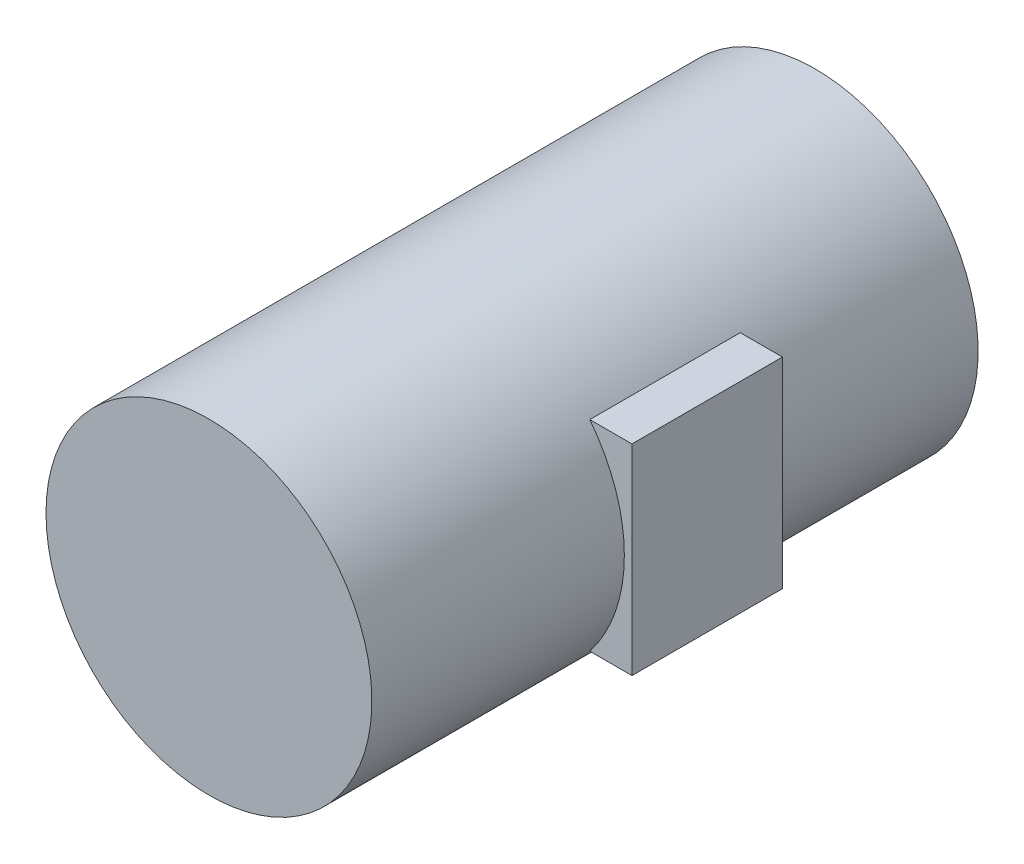
ISO-10303-21;
HEADER;
FILE_DESCRIPTION(('STEP AP214'),'2;1');
FILE_NAME('part.step','',(''),(''),'','','');
FILE_SCHEMA(('AUTOMOTIVE_DESIGN { 1 0 10303 214 1 1 1 1 }'));
ENDSEC;
DATA;
#1=APPLICATION_CONTEXT('core data for automotive mechanical design processes');
#2=APPLICATION_PROTOCOL_DEFINITION('international standard','automotive_design',2000,#1);
#3=PRODUCT_CONTEXT('',#1,'mechanical');
#4=PRODUCT('Part','Part','',(#3));
#5=PRODUCT_RELATED_PRODUCT_CATEGORY('part','',(#4));
#6=PRODUCT_DEFINITION_FORMATION('','',#4);
#7=PRODUCT_DEFINITION_CONTEXT('part definition',#1,'design');
#8=PRODUCT_DEFINITION('design','',#6,#7);
#9=PRODUCT_DEFINITION_SHAPE('','',#8);
#10=(LENGTH_UNIT() NAMED_UNIT(*) SI_UNIT(.MILLI.,.METRE.));
#11=(NAMED_UNIT(*) PLANE_ANGLE_UNIT() SI_UNIT($,.RADIAN.));
#12=(NAMED_UNIT(*) SI_UNIT($,.STERADIAN.) SOLID_ANGLE_UNIT());
#13=UNCERTAINTY_MEASURE_WITH_UNIT(LENGTH_MEASURE(1.E-05),#10,'distance_accuracy_value','');
#14=(GEOMETRIC_REPRESENTATION_CONTEXT(3) GLOBAL_UNCERTAINTY_ASSIGNED_CONTEXT((#13)) GLOBAL_UNIT_ASSIGNED_CONTEXT((#10,
#11,#12)) REPRESENTATION_CONTEXT('',''));
#15=CARTESIAN_POINT('',(0.,0.,0.));
#16=DIRECTION('',(0.,0.,1.));
#17=DIRECTION('',(1.,0.,0.));
#18=AXIS2_PLACEMENT_3D('',#15,#16,#17);
#19=CARTESIAN_POINT('',(0.,0.,-0.25));
#20=DIRECTION('',(0.,0.,-1.));
#21=DIRECTION('',(-1.,0.,0.));
#22=AXIS2_PLACEMENT_3D('',#19,#20,#21);
#23=CYLINDRICAL_SURFACE('',#22,41.25);
#24=CARTESIAN_POINT('',(0.,0.,-0.25));
#25=DIRECTION('',(0.,0.,-1.));
#26=DIRECTION('',(-1.,0.,0.));
#27=AXIS2_PLACEMENT_3D('',#24,#25,#26);
#28=CIRCLE('',#27,41.25);
#29=CARTESIAN_POINT('',(-41.25,0.,-0.25));
#30=VERTEX_POINT('',#29);
#31=EDGE_CURVE('E98',#30,#30,#28,.T.);
#32=ORIENTED_EDGE('',*,*,#31,.T.);
#33=EDGE_LOOP('',(#32));
#34=FACE_BOUND('',#33,.T.);
#35=CARTESIAN_POINT('',(0.,0.,-153.751));
#36=DIRECTION('',(0.,0.,-1.));
#37=DIRECTION('',(-1.,0.,0.));
#38=AXIS2_PLACEMENT_3D('',#35,#36,#37);
#39=CIRCLE('',#38,41.25);
#40=CARTESIAN_POINT('',(-41.25,0.,-153.751));
#41=VERTEX_POINT('',#40);
#42=EDGE_CURVE('E94',#41,#41,#39,.F.);
#43=ORIENTED_EDGE('',*,*,#42,.T.);
#44=EDGE_LOOP('',(#43));
#45=FACE_BOUND('',#44,.T.);
#46=DIRECTION('',(0.,0.,-1.));
#47=VECTOR('',#46,1.);
#48=CARTESIAN_POINT('',(32.5023460691689,-25.3999999999997,-0.249999999999899));
#49=LINE('',#48,#47);
#50=CARTESIAN_POINT('',(32.5023460691686,-25.4000000000001,-102.2755));
#51=VERTEX_POINT('',#50);
#52=CARTESIAN_POINT('',(32.5023460691689,-25.3999999999999,-64.1755));
#53=VERTEX_POINT('',#52);
#54=EDGE_CURVE('E45',#51,#53,#49,.F.);
#55=ORIENTED_EDGE('',*,*,#54,.T.);
#56=CARTESIAN_POINT('',(0.,0.,-64.1755));
#57=DIRECTION('',(0.,0.,-1.));
#58=DIRECTION('',(-1.,0.,0.));
#59=AXIS2_PLACEMENT_3D('',#56,#57,#58);
#60=CIRCLE('',#59,41.25);
#61=CARTESIAN_POINT('',(32.5023460691687,25.3999999999999,-64.1755));
#62=VERTEX_POINT('',#61);
#63=EDGE_CURVE('E11',#53,#62,#60,.F.);
#64=ORIENTED_EDGE('',*,*,#63,.T.);
#65=DIRECTION('',(0.,0.,-1.));
#66=VECTOR('',#65,1.);
#67=CARTESIAN_POINT('',(32.5023460691687,25.3999999999999,-0.249999999999997));
#68=LINE('',#67,#66);
#69=CARTESIAN_POINT('',(32.5023460691687,25.3999999999999,-102.2755));
#70=VERTEX_POINT('',#69);
#71=EDGE_CURVE('E93',#62,#70,#68,.T.);
#72=ORIENTED_EDGE('',*,*,#71,.T.);
#73=CARTESIAN_POINT('',(0.,0.,-102.2755));
#74=DIRECTION('',(0.,0.,1.));
#75=DIRECTION('',(1.,0.,0.));
#76=AXIS2_PLACEMENT_3D('',#73,#74,#75);
#77=CIRCLE('',#76,41.25);
#78=EDGE_CURVE('E108',#70,#51,#77,.F.);
#79=ORIENTED_EDGE('',*,*,#78,.T.);
#80=EDGE_LOOP('',(#55,#64,#72,#79));
#81=FACE_BOUND('',#80,.T.);
#82=ADVANCED_FACE('F37',(#34,#45,#81),#23,.T.);
#83=CARTESIAN_POINT('',(0.,0.,-153.751));
#84=DIRECTION('',(0.,0.,-1.));
#85=DIRECTION('',(-1.,0.,0.));
#86=AXIS2_PLACEMENT_3D('',#83,#84,#85);
#87=PLANE('',#86);
#88=ORIENTED_EDGE('',*,*,#42,.F.);
#89=EDGE_LOOP('',(#88));
#90=FACE_BOUND('',#89,.T.);
#91=ADVANCED_FACE('F39',(#90),#87,.T.);
#92=CARTESIAN_POINT('',(0.,0.,-0.25));
#93=DIRECTION('',(0.,0.,-1.));
#94=DIRECTION('',(-1.,0.,0.));
#95=AXIS2_PLACEMENT_3D('',#92,#93,#94);
#96=PLANE('',#95);
#97=ORIENTED_EDGE('',*,*,#31,.F.);
#98=EDGE_LOOP('',(#97));
#99=FACE_BOUND('',#98,.T.);
#100=ADVANCED_FACE('F132',(#99),#96,.F.);
#101=CARTESIAN_POINT('',(43.18,25.3999999999999,-64.1755));
#102=DIRECTION('',(0.,0.,-1.));
#103=DIRECTION('',(-1.,0.,0.));
#104=AXIS2_PLACEMENT_3D('',#101,#102,#103);
#105=PLANE('',#104);
#106=ORIENTED_EDGE('',*,*,#63,.F.);
#107=DIRECTION('',(-1.,0.,0.));
#108=VECTOR('',#107,1.);
#109=CARTESIAN_POINT('',(43.18,-25.3999999999999,-64.1755));
#110=LINE('',#109,#108);
#111=CARTESIAN_POINT('',(43.18,-25.3999999999999,-64.1755));
#112=VERTEX_POINT('',#111);
#113=EDGE_CURVE('E80',#112,#53,#110,.T.);
#114=ORIENTED_EDGE('',*,*,#113,.F.);
#115=DIRECTION('',(0.,-1.,0.));
#116=VECTOR('',#115,1.);
#117=CARTESIAN_POINT('',(43.18,25.3999999999999,-64.1755));
#118=LINE('',#117,#116);
#119=CARTESIAN_POINT('',(43.18,25.3999999999999,-64.1755));
#120=VERTEX_POINT('',#119);
#121=EDGE_CURVE('E75',#120,#112,#118,.T.);
#122=ORIENTED_EDGE('',*,*,#121,.F.);
#123=DIRECTION('',(-1.,0.,0.));
#124=VECTOR('',#123,1.);
#125=CARTESIAN_POINT('',(43.18,25.3999999999999,-64.1755));
#126=LINE('',#125,#124);
#127=EDGE_CURVE('E79',#120,#62,#126,.T.);
#128=ORIENTED_EDGE('',*,*,#127,.T.);
#129=EDGE_LOOP('',(#106,#114,#122,#128));
#130=FACE_BOUND('',#129,.T.);
#131=ADVANCED_FACE('F77',(#130),#105,.F.);
#132=CARTESIAN_POINT('',(43.18,-25.4,-76.8755));
#133=DIRECTION('',(0.,1.,0.));
#134=DIRECTION('',(0.,0.,1.));
#135=AXIS2_PLACEMENT_3D('',#132,#133,#134);
#136=PLANE('',#135);
#137=ORIENTED_EDGE('',*,*,#54,.F.);
#138=DIRECTION('',(-1.,0.,0.));
#139=VECTOR('',#138,1.);
#140=CARTESIAN_POINT('',(43.18,-25.4000000000001,-102.2755));
#141=LINE('',#140,#139);
#142=CARTESIAN_POINT('',(43.18,-25.4000000000001,-102.2755));
#143=VERTEX_POINT('',#142);
#144=EDGE_CURVE('E100',#143,#51,#141,.T.);
#145=ORIENTED_EDGE('',*,*,#144,.F.);
#146=DIRECTION('',(0.,0.,-1.));
#147=VECTOR('',#146,1.);
#148=CARTESIAN_POINT('',(43.18,-25.3999999999999,-64.1755));
#149=LINE('',#148,#147);
#150=EDGE_CURVE('E83',#112,#143,#149,.T.);
#151=ORIENTED_EDGE('',*,*,#150,.F.);
#152=ORIENTED_EDGE('',*,*,#113,.T.);
#153=EDGE_LOOP('',(#137,#145,#151,#152));
#154=FACE_BOUND('',#153,.T.);
#155=ADVANCED_FACE('F115',(#154),#136,.F.);
#156=CARTESIAN_POINT('',(43.18,25.3999999999999,-102.2755));
#157=DIRECTION('',(0.,0.,1.));
#158=DIRECTION('',(1.,0.,0.));
#159=AXIS2_PLACEMENT_3D('',#156,#157,#158);
#160=PLANE('',#159);
#161=ORIENTED_EDGE('',*,*,#78,.F.);
#162=DIRECTION('',(-1.,0.,0.));
#163=VECTOR('',#162,1.);
#164=CARTESIAN_POINT('',(43.18,25.3999999999999,-102.2755));
#165=LINE('',#164,#163);
#166=CARTESIAN_POINT('',(43.18,25.3999999999999,-102.2755));
#167=VERTEX_POINT('',#166);
#168=EDGE_CURVE('E52',#167,#70,#165,.T.);
#169=ORIENTED_EDGE('',*,*,#168,.F.);
#170=DIRECTION('',(0.,1.,0.));
#171=VECTOR('',#170,1.);
#172=CARTESIAN_POINT('',(43.18,25.3999999999999,-102.2755));
#173=LINE('',#172,#171);
#174=EDGE_CURVE('E89',#143,#167,#173,.T.);
#175=ORIENTED_EDGE('',*,*,#174,.F.);
#176=ORIENTED_EDGE('',*,*,#144,.T.);
#177=EDGE_LOOP('',(#161,#169,#175,#176));
#178=FACE_BOUND('',#177,.T.);
#179=ADVANCED_FACE('F117',(#178),#160,.F.);
#180=CARTESIAN_POINT('',(43.18,25.3999999999999,-76.8755));
#181=DIRECTION('',(0.,-1.,0.));
#182=DIRECTION('',(0.,0.,-1.));
#183=AXIS2_PLACEMENT_3D('',#180,#181,#182);
#184=PLANE('',#183);
#185=ORIENTED_EDGE('',*,*,#71,.F.);
#186=ORIENTED_EDGE('',*,*,#127,.F.);
#187=DIRECTION('',(0.,0.,1.));
#188=VECTOR('',#187,1.);
#189=CARTESIAN_POINT('',(43.18,25.3999999999999,-76.8755));
#190=LINE('',#189,#188);
#191=EDGE_CURVE('E84',#167,#120,#190,.T.);
#192=ORIENTED_EDGE('',*,*,#191,.F.);
#193=ORIENTED_EDGE('',*,*,#168,.T.);
#194=EDGE_LOOP('',(#185,#186,#192,#193));
#195=FACE_BOUND('',#194,.T.);
#196=ADVANCED_FACE('F91',(#195),#184,.F.);
#197=CARTESIAN_POINT('',(43.18,0.,0.));
#198=DIRECTION('',(1.,0.,0.));
#199=DIRECTION('',(0.,0.,-1.));
#200=AXIS2_PLACEMENT_3D('',#197,#198,#199);
#201=PLANE('',#200);
#202=ORIENTED_EDGE('',*,*,#191,.T.);
#203=ORIENTED_EDGE('',*,*,#121,.T.);
#204=ORIENTED_EDGE('',*,*,#150,.T.);
#205=ORIENTED_EDGE('',*,*,#174,.T.);
#206=EDGE_LOOP('',(#202,#203,#204,#205));
#207=FACE_BOUND('',#206,.T.);
#208=ADVANCED_FACE('F87',(#207),#201,.T.);
#209=CLOSED_SHELL('',(#82,#91,#100,#131,#155,#179,#196,#208));
#210=MANIFOLD_SOLID_BREP('B2',#209);
#211=ADVANCED_BREP_SHAPE_REPRESENTATION('',(#18,#210),#14);
#212=SHAPE_DEFINITION_REPRESENTATION(#9,#211);
ENDSEC;
END-ISO-10303-21;
